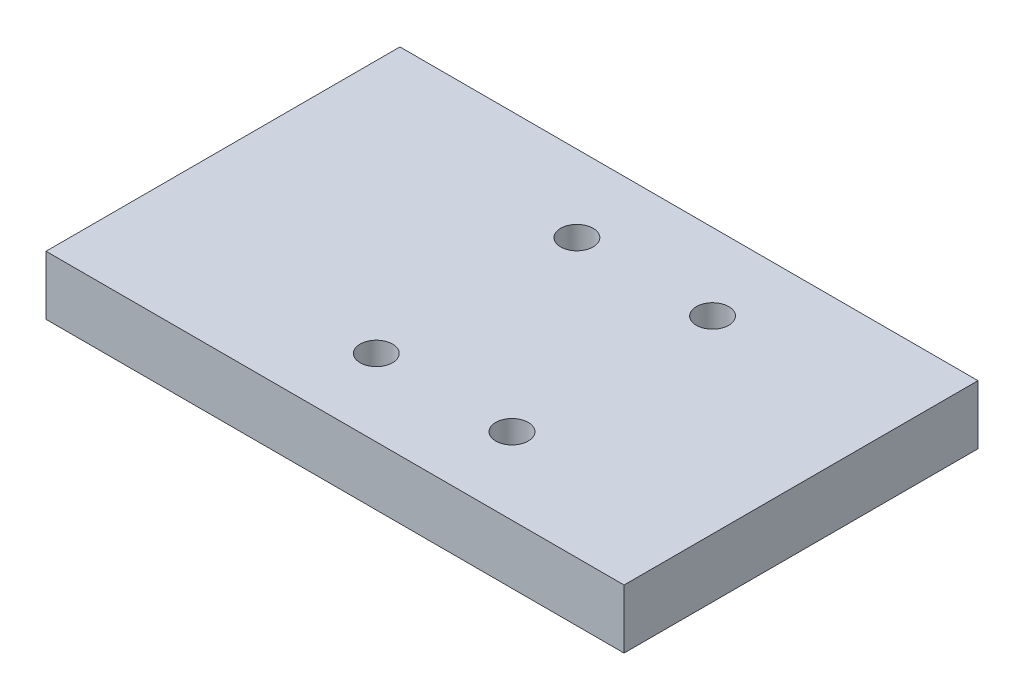
ISO-10303-21;
HEADER;
FILE_DESCRIPTION(('STEP AP214'),'2;1');
FILE_NAME('part.step','',(''),(''),'','','');
FILE_SCHEMA(('AUTOMOTIVE_DESIGN { 1 0 10303 214 1 1 1 1 }'));
ENDSEC;
DATA;
#1=APPLICATION_CONTEXT('core data for automotive mechanical design processes');
#2=APPLICATION_PROTOCOL_DEFINITION('international standard','automotive_design',2000,#1);
#3=PRODUCT_CONTEXT('',#1,'mechanical');
#4=PRODUCT('Part','Part','',(#3));
#5=PRODUCT_RELATED_PRODUCT_CATEGORY('part','',(#4));
#6=PRODUCT_DEFINITION_FORMATION('','',#4);
#7=PRODUCT_DEFINITION_CONTEXT('part definition',#1,'design');
#8=PRODUCT_DEFINITION('design','',#6,#7);
#9=PRODUCT_DEFINITION_SHAPE('','',#8);
#10=(LENGTH_UNIT() NAMED_UNIT(*) SI_UNIT(.MILLI.,.METRE.));
#11=(NAMED_UNIT(*) PLANE_ANGLE_UNIT() SI_UNIT($,.RADIAN.));
#12=(NAMED_UNIT(*) SI_UNIT($,.STERADIAN.) SOLID_ANGLE_UNIT());
#13=UNCERTAINTY_MEASURE_WITH_UNIT(LENGTH_MEASURE(1.E-05),#10,'distance_accuracy_value','');
#14=(GEOMETRIC_REPRESENTATION_CONTEXT(3) GLOBAL_UNCERTAINTY_ASSIGNED_CONTEXT((#13)) GLOBAL_UNIT_ASSIGNED_CONTEXT((#10,
#11,#12)) REPRESENTATION_CONTEXT('',''));
#15=CARTESIAN_POINT('',(0.,0.,0.));
#16=DIRECTION('',(0.,0.,1.));
#17=DIRECTION('',(1.,0.,0.));
#18=AXIS2_PLACEMENT_3D('',#15,#16,#17);
#19=CARTESIAN_POINT('',(-49.,10.,30.));
#20=DIRECTION('',(1.,0.,0.));
#21=DIRECTION('',(0.,0.,-1.));
#22=AXIS2_PLACEMENT_3D('',#19,#20,#21);
#23=PLANE('',#22);
#24=DIRECTION('',(0.,0.,1.));
#25=VECTOR('',#24,1.);
#26=CARTESIAN_POINT('',(-49.,0.,30.));
#27=LINE('',#26,#25);
#28=CARTESIAN_POINT('',(-49.,0.,-30.));
#29=VERTEX_POINT('',#28);
#30=CARTESIAN_POINT('',(-49.,0.,30.));
#31=VERTEX_POINT('',#30);
#32=EDGE_CURVE('E104',#29,#31,#27,.T.);
#33=ORIENTED_EDGE('',*,*,#32,.T.);
#34=DIRECTION('',(0.,-1.,0.));
#35=VECTOR('',#34,1.);
#36=CARTESIAN_POINT('',(-49.,10.,30.));
#37=LINE('',#36,#35);
#38=CARTESIAN_POINT('',(-49.,10.,30.));
#39=VERTEX_POINT('',#38);
#40=EDGE_CURVE('E11',#39,#31,#37,.T.);
#41=ORIENTED_EDGE('',*,*,#40,.F.);
#42=DIRECTION('',(0.,0.,1.));
#43=VECTOR('',#42,1.);
#44=CARTESIAN_POINT('',(-49.,10.,30.));
#45=LINE('',#44,#43);
#46=CARTESIAN_POINT('',(-49.,10.,-30.));
#47=VERTEX_POINT('',#46);
#48=EDGE_CURVE('E92',#47,#39,#45,.T.);
#49=ORIENTED_EDGE('',*,*,#48,.F.);
#50=DIRECTION('',(0.,-1.,0.));
#51=VECTOR('',#50,1.);
#52=CARTESIAN_POINT('',(-49.,10.,-30.));
#53=LINE('',#52,#51);
#54=EDGE_CURVE('E100',#47,#29,#53,.T.);
#55=ORIENTED_EDGE('',*,*,#54,.T.);
#56=EDGE_LOOP('',(#33,#41,#49,#55));
#57=FACE_BOUND('',#56,.T.);
#58=ADVANCED_FACE('F41',(#57),#23,.F.);
#59=CARTESIAN_POINT('',(49.,10.,30.));
#60=DIRECTION('',(0.,0.,-1.));
#61=DIRECTION('',(-1.,0.,0.));
#62=AXIS2_PLACEMENT_3D('',#59,#60,#61);
#63=PLANE('',#62);
#64=DIRECTION('',(1.,0.,0.));
#65=VECTOR('',#64,1.);
#66=CARTESIAN_POINT('',(49.,0.,30.));
#67=LINE('',#66,#65);
#68=CARTESIAN_POINT('',(49.,0.,30.));
#69=VERTEX_POINT('',#68);
#70=EDGE_CURVE('E96',#31,#69,#67,.T.);
#71=ORIENTED_EDGE('',*,*,#70,.T.);
#72=DIRECTION('',(0.,-1.,0.));
#73=VECTOR('',#72,1.);
#74=CARTESIAN_POINT('',(49.,10.,30.));
#75=LINE('',#74,#73);
#76=CARTESIAN_POINT('',(49.,10.,30.));
#77=VERTEX_POINT('',#76);
#78=EDGE_CURVE('E49',#77,#69,#75,.T.);
#79=ORIENTED_EDGE('',*,*,#78,.F.);
#80=DIRECTION('',(1.,0.,0.));
#81=VECTOR('',#80,1.);
#82=CARTESIAN_POINT('',(49.,10.,30.));
#83=LINE('',#82,#81);
#84=EDGE_CURVE('E87',#39,#77,#83,.T.);
#85=ORIENTED_EDGE('',*,*,#84,.F.);
#86=ORIENTED_EDGE('',*,*,#40,.T.);
#87=EDGE_LOOP('',(#71,#79,#85,#86));
#88=FACE_BOUND('',#87,.T.);
#89=ADVANCED_FACE('F95',(#88),#63,.F.);
#90=CARTESIAN_POINT('',(49.,10.,30.));
#91=DIRECTION('',(-1.,0.,0.));
#92=DIRECTION('',(0.,0.,1.));
#93=AXIS2_PLACEMENT_3D('',#90,#91,#92);
#94=PLANE('',#93);
#95=DIRECTION('',(0.,0.,-1.));
#96=VECTOR('',#95,1.);
#97=CARTESIAN_POINT('',(49.,0.,30.));
#98=LINE('',#97,#96);
#99=CARTESIAN_POINT('',(49.,0.,-30.));
#100=VERTEX_POINT('',#99);
#101=EDGE_CURVE('E74',#69,#100,#98,.T.);
#102=ORIENTED_EDGE('',*,*,#101,.T.);
#103=DIRECTION('',(0.,-1.,0.));
#104=VECTOR('',#103,1.);
#105=CARTESIAN_POINT('',(49.,10.,-30.));
#106=LINE('',#105,#104);
#107=CARTESIAN_POINT('',(49.,10.,-30.));
#108=VERTEX_POINT('',#107);
#109=EDGE_CURVE('E97',#108,#100,#106,.T.);
#110=ORIENTED_EDGE('',*,*,#109,.F.);
#111=DIRECTION('',(0.,0.,-1.));
#112=VECTOR('',#111,1.);
#113=CARTESIAN_POINT('',(49.,10.,30.));
#114=LINE('',#113,#112);
#115=EDGE_CURVE('E90',#77,#108,#114,.T.);
#116=ORIENTED_EDGE('',*,*,#115,.F.);
#117=ORIENTED_EDGE('',*,*,#78,.T.);
#118=EDGE_LOOP('',(#102,#110,#116,#117));
#119=FACE_BOUND('',#118,.T.);
#120=ADVANCED_FACE('F98',(#119),#94,.F.);
#121=CARTESIAN_POINT('',(49.,10.,-30.));
#122=DIRECTION('',(0.,0.,1.));
#123=DIRECTION('',(1.,0.,0.));
#124=AXIS2_PLACEMENT_3D('',#121,#122,#123);
#125=PLANE('',#124);
#126=DIRECTION('',(-1.,0.,0.));
#127=VECTOR('',#126,1.);
#128=CARTESIAN_POINT('',(49.,0.,-30.));
#129=LINE('',#128,#127);
#130=EDGE_CURVE('E80',#100,#29,#129,.T.);
#131=ORIENTED_EDGE('',*,*,#130,.T.);
#132=ORIENTED_EDGE('',*,*,#54,.F.);
#133=DIRECTION('',(-1.,0.,0.));
#134=VECTOR('',#133,1.);
#135=CARTESIAN_POINT('',(49.,10.,-30.));
#136=LINE('',#135,#134);
#137=EDGE_CURVE('E57',#108,#47,#136,.T.);
#138=ORIENTED_EDGE('',*,*,#137,.F.);
#139=ORIENTED_EDGE('',*,*,#109,.T.);
#140=EDGE_LOOP('',(#131,#132,#138,#139));
#141=FACE_BOUND('',#140,.T.);
#142=ADVANCED_FACE('F112',(#141),#125,.F.);
#143=CARTESIAN_POINT('',(0.,10.,0.));
#144=DIRECTION('',(0.,1.,0.));
#145=DIRECTION('',(0.,0.,1.));
#146=AXIS2_PLACEMENT_3D('',#143,#144,#145);
#147=PLANE('',#146);
#148=CARTESIAN_POINT('',(-6.00000000000001,10.,-17.));
#149=DIRECTION('',(0.,-1.,0.));
#150=DIRECTION('',(0.,0.,-1.));
#151=AXIS2_PLACEMENT_3D('',#148,#149,#150);
#152=CIRCLE('',#151,2.75);
#153=CARTESIAN_POINT('',(-6.00000000000001,10.,-19.75));
#154=VERTEX_POINT('',#153);
#155=EDGE_CURVE('E153',#154,#154,#152,.T.);
#156=ORIENTED_EDGE('',*,*,#155,.T.);
#157=EDGE_LOOP('',(#156));
#158=FACE_BOUND('',#157,.T.);
#159=CARTESIAN_POINT('',(17.,10.,-17.));
#160=DIRECTION('',(0.,-1.,0.));
#161=DIRECTION('',(0.,0.,-1.));
#162=AXIS2_PLACEMENT_3D('',#159,#160,#161);
#163=CIRCLE('',#162,2.75);
#164=CARTESIAN_POINT('',(17.,10.,-19.75));
#165=VERTEX_POINT('',#164);
#166=EDGE_CURVE('E141',#165,#165,#163,.T.);
#167=ORIENTED_EDGE('',*,*,#166,.T.);
#168=EDGE_LOOP('',(#167));
#169=FACE_BOUND('',#168,.T.);
#170=CARTESIAN_POINT('',(17.,10.,17.));
#171=DIRECTION('',(0.,-1.,0.));
#172=DIRECTION('',(0.,0.,-1.));
#173=AXIS2_PLACEMENT_3D('',#170,#171,#172);
#174=CIRCLE('',#173,2.75);
#175=CARTESIAN_POINT('',(17.,10.,14.25));
#176=VERTEX_POINT('',#175);
#177=EDGE_CURVE('E129',#176,#176,#174,.T.);
#178=ORIENTED_EDGE('',*,*,#177,.T.);
#179=EDGE_LOOP('',(#178));
#180=FACE_BOUND('',#179,.T.);
#181=CARTESIAN_POINT('',(-6.00000000000001,10.,17.));
#182=DIRECTION('',(0.,-1.,0.));
#183=DIRECTION('',(0.,0.,-1.));
#184=AXIS2_PLACEMENT_3D('',#181,#182,#183);
#185=CIRCLE('',#184,2.75);
#186=CARTESIAN_POINT('',(-6.00000000000001,10.,14.25));
#187=VERTEX_POINT('',#186);
#188=EDGE_CURVE('E107',#187,#187,#185,.T.);
#189=ORIENTED_EDGE('',*,*,#188,.T.);
#190=EDGE_LOOP('',(#189));
#191=FACE_BOUND('',#190,.T.);
#192=ORIENTED_EDGE('',*,*,#48,.T.);
#193=ORIENTED_EDGE('',*,*,#84,.T.);
#194=ORIENTED_EDGE('',*,*,#115,.T.);
#195=ORIENTED_EDGE('',*,*,#137,.T.);
#196=EDGE_LOOP('',(#192,#193,#194,#195));
#197=FACE_BOUND('',#196,.T.);
#198=ADVANCED_FACE('F88',(#158,#169,#180,#191,#197),#147,.T.);
#199=CARTESIAN_POINT('',(0.,0.,0.));
#200=DIRECTION('',(0.,1.,0.));
#201=DIRECTION('',(0.,0.,1.));
#202=AXIS2_PLACEMENT_3D('',#199,#200,#201);
#203=PLANE('',#202);
#204=CARTESIAN_POINT('',(-6.00000000000001,0.,-17.));
#205=DIRECTION('',(0.,-1.,0.));
#206=DIRECTION('',(0.,0.,-1.));
#207=AXIS2_PLACEMENT_3D('',#204,#205,#206);
#208=CIRCLE('',#207,4.99999999999999);
#209=CARTESIAN_POINT('',(-6.00000000000001,0.,-22.));
#210=VERTEX_POINT('',#209);
#211=EDGE_CURVE('E162',#210,#210,#208,.T.);
#212=ORIENTED_EDGE('',*,*,#211,.F.);
#213=EDGE_LOOP('',(#212));
#214=FACE_BOUND('',#213,.T.);
#215=CARTESIAN_POINT('',(17.,0.,-17.));
#216=DIRECTION('',(0.,-1.,0.));
#217=DIRECTION('',(0.,0.,-1.));
#218=AXIS2_PLACEMENT_3D('',#215,#216,#217);
#219=CIRCLE('',#218,4.99999999999999);
#220=CARTESIAN_POINT('',(17.,0.,-22.));
#221=VERTEX_POINT('',#220);
#222=EDGE_CURVE('E150',#221,#221,#219,.T.);
#223=ORIENTED_EDGE('',*,*,#222,.F.);
#224=EDGE_LOOP('',(#223));
#225=FACE_BOUND('',#224,.T.);
#226=CARTESIAN_POINT('',(17.,0.,17.));
#227=DIRECTION('',(0.,-1.,0.));
#228=DIRECTION('',(0.,0.,-1.));
#229=AXIS2_PLACEMENT_3D('',#226,#227,#228);
#230=CIRCLE('',#229,4.99999999999999);
#231=CARTESIAN_POINT('',(17.,0.,12.));
#232=VERTEX_POINT('',#231);
#233=EDGE_CURVE('E138',#232,#232,#230,.T.);
#234=ORIENTED_EDGE('',*,*,#233,.F.);
#235=EDGE_LOOP('',(#234));
#236=FACE_BOUND('',#235,.T.);
#237=CARTESIAN_POINT('',(-6.00000000000001,0.,17.));
#238=DIRECTION('',(0.,-1.,0.));
#239=DIRECTION('',(0.,0.,-1.));
#240=AXIS2_PLACEMENT_3D('',#237,#238,#239);
#241=CIRCLE('',#240,4.99999999999999);
#242=CARTESIAN_POINT('',(-6.00000000000001,0.,12.));
#243=VERTEX_POINT('',#242);
#244=EDGE_CURVE('E126',#243,#243,#241,.T.);
#245=ORIENTED_EDGE('',*,*,#244,.F.);
#246=EDGE_LOOP('',(#245));
#247=FACE_BOUND('',#246,.T.);
#248=ORIENTED_EDGE('',*,*,#32,.F.);
#249=ORIENTED_EDGE('',*,*,#130,.F.);
#250=ORIENTED_EDGE('',*,*,#101,.F.);
#251=ORIENTED_EDGE('',*,*,#70,.F.);
#252=EDGE_LOOP('',(#248,#249,#250,#251));
#253=FACE_BOUND('',#252,.T.);
#254=ADVANCED_FACE('F115',(#214,#225,#236,#247,#253),#203,.F.);
#255=CARTESIAN_POINT('',(-6.00000000000001,0.,17.));
#256=DIRECTION('',(0.,-1.,0.));
#257=DIRECTION('',(0.,0.,-1.));
#258=AXIS2_PLACEMENT_3D('',#255,#256,#257);
#259=CYLINDRICAL_SURFACE('',#258,2.75);
#260=ORIENTED_EDGE('',*,*,#188,.F.);
#261=EDGE_LOOP('',(#260));
#262=FACE_BOUND('',#261,.T.);
#263=CARTESIAN_POINT('',(-6.00000000000001,5.4,17.));
#264=DIRECTION('',(0.,-1.,0.));
#265=DIRECTION('',(0.,0.,-1.));
#266=AXIS2_PLACEMENT_3D('',#263,#264,#265);
#267=CIRCLE('',#266,2.75);
#268=CARTESIAN_POINT('',(-6.00000000000001,5.4,14.25));
#269=VERTEX_POINT('',#268);
#270=EDGE_CURVE('E120',#269,#269,#267,.T.);
#271=ORIENTED_EDGE('',*,*,#270,.T.);
#272=EDGE_LOOP('',(#271));
#273=FACE_BOUND('',#272,.T.);
#274=ADVANCED_FACE('F170',(#262,#273),#259,.F.);
#275=CARTESIAN_POINT('',(-3.25000000000001,5.4,17.));
#276=DIRECTION('',(0.,1.,0.));
#277=DIRECTION('',(0.,0.,1.));
#278=AXIS2_PLACEMENT_3D('',#275,#276,#277);
#279=PLANE('',#278);
#280=ORIENTED_EDGE('',*,*,#270,.F.);
#281=EDGE_LOOP('',(#280));
#282=FACE_BOUND('',#281,.T.);
#283=CARTESIAN_POINT('',(-6.00000000000001,5.4,17.));
#284=DIRECTION('',(0.,-1.,0.));
#285=DIRECTION('',(0.,0.,-1.));
#286=AXIS2_PLACEMENT_3D('',#283,#284,#285);
#287=CIRCLE('',#286,5.);
#288=CARTESIAN_POINT('',(-6.00000000000001,5.4,12.));
#289=VERTEX_POINT('',#288);
#290=EDGE_CURVE('E123',#289,#289,#287,.T.);
#291=ORIENTED_EDGE('',*,*,#290,.T.);
#292=EDGE_LOOP('',(#291));
#293=FACE_BOUND('',#292,.T.);
#294=ADVANCED_FACE('F181',(#282,#293),#279,.F.);
#295=CARTESIAN_POINT('',(-6.00000000000001,0.,17.));
#296=DIRECTION('',(0.,-1.,0.));
#297=DIRECTION('',(0.,0.,-1.));
#298=AXIS2_PLACEMENT_3D('',#295,#296,#297);
#299=CYLINDRICAL_SURFACE('',#298,4.99999999999999);
#300=ORIENTED_EDGE('',*,*,#290,.F.);
#301=EDGE_LOOP('',(#300));
#302=FACE_BOUND('',#301,.T.);
#303=ORIENTED_EDGE('',*,*,#244,.T.);
#304=EDGE_LOOP('',(#303));
#305=FACE_BOUND('',#304,.T.);
#306=ADVANCED_FACE('F178',(#302,#305),#299,.F.);
#307=CARTESIAN_POINT('',(17.,0.,17.));
#308=DIRECTION('',(0.,-1.,0.));
#309=DIRECTION('',(0.,0.,-1.));
#310=AXIS2_PLACEMENT_3D('',#307,#308,#309);
#311=CYLINDRICAL_SURFACE('',#310,2.75);
#312=ORIENTED_EDGE('',*,*,#177,.F.);
#313=EDGE_LOOP('',(#312));
#314=FACE_BOUND('',#313,.T.);
#315=CARTESIAN_POINT('',(17.,5.4,17.));
#316=DIRECTION('',(0.,-1.,0.));
#317=DIRECTION('',(0.,0.,-1.));
#318=AXIS2_PLACEMENT_3D('',#315,#316,#317);
#319=CIRCLE('',#318,2.75);
#320=CARTESIAN_POINT('',(17.,5.4,14.25));
#321=VERTEX_POINT('',#320);
#322=EDGE_CURVE('E132',#321,#321,#319,.T.);
#323=ORIENTED_EDGE('',*,*,#322,.T.);
#324=EDGE_LOOP('',(#323));
#325=FACE_BOUND('',#324,.T.);
#326=ADVANCED_FACE('F180',(#314,#325),#311,.F.);
#327=CARTESIAN_POINT('',(19.75,5.4,17.));
#328=DIRECTION('',(0.,1.,0.));
#329=DIRECTION('',(0.,0.,1.));
#330=AXIS2_PLACEMENT_3D('',#327,#328,#329);
#331=PLANE('',#330);
#332=ORIENTED_EDGE('',*,*,#322,.F.);
#333=EDGE_LOOP('',(#332));
#334=FACE_BOUND('',#333,.T.);
#335=CARTESIAN_POINT('',(17.,5.4,17.));
#336=DIRECTION('',(0.,-1.,0.));
#337=DIRECTION('',(0.,0.,-1.));
#338=AXIS2_PLACEMENT_3D('',#335,#336,#337);
#339=CIRCLE('',#338,5.);
#340=CARTESIAN_POINT('',(17.,5.4,12.));
#341=VERTEX_POINT('',#340);
#342=EDGE_CURVE('E135',#341,#341,#339,.T.);
#343=ORIENTED_EDGE('',*,*,#342,.T.);
#344=EDGE_LOOP('',(#343));
#345=FACE_BOUND('',#344,.T.);
#346=ADVANCED_FACE('F188',(#334,#345),#331,.F.);
#347=CARTESIAN_POINT('',(17.,0.,17.));
#348=DIRECTION('',(0.,-1.,0.));
#349=DIRECTION('',(0.,0.,-1.));
#350=AXIS2_PLACEMENT_3D('',#347,#348,#349);
#351=CYLINDRICAL_SURFACE('',#350,5.);
#352=ORIENTED_EDGE('',*,*,#342,.F.);
#353=EDGE_LOOP('',(#352));
#354=FACE_BOUND('',#353,.T.);
#355=ORIENTED_EDGE('',*,*,#233,.T.);
#356=EDGE_LOOP('',(#355));
#357=FACE_BOUND('',#356,.T.);
#358=ADVANCED_FACE('F236',(#354,#357),#351,.F.);
#359=CARTESIAN_POINT('',(17.,0.,-17.));
#360=DIRECTION('',(0.,-1.,0.));
#361=DIRECTION('',(0.,0.,-1.));
#362=AXIS2_PLACEMENT_3D('',#359,#360,#361);
#363=CYLINDRICAL_SURFACE('',#362,2.75);
#364=ORIENTED_EDGE('',*,*,#166,.F.);
#365=EDGE_LOOP('',(#364));
#366=FACE_BOUND('',#365,.T.);
#367=CARTESIAN_POINT('',(17.,5.4,-17.));
#368=DIRECTION('',(0.,-1.,0.));
#369=DIRECTION('',(0.,0.,-1.));
#370=AXIS2_PLACEMENT_3D('',#367,#368,#369);
#371=CIRCLE('',#370,2.75);
#372=CARTESIAN_POINT('',(17.,5.4,-19.75));
#373=VERTEX_POINT('',#372);
#374=EDGE_CURVE('E144',#373,#373,#371,.T.);
#375=ORIENTED_EDGE('',*,*,#374,.T.);
#376=EDGE_LOOP('',(#375));
#377=FACE_BOUND('',#376,.T.);
#378=ADVANCED_FACE('F244',(#366,#377),#363,.F.);
#379=CARTESIAN_POINT('',(19.75,5.4,-17.));
#380=DIRECTION('',(0.,1.,0.));
#381=DIRECTION('',(0.,0.,1.));
#382=AXIS2_PLACEMENT_3D('',#379,#380,#381);
#383=PLANE('',#382);
#384=ORIENTED_EDGE('',*,*,#374,.F.);
#385=EDGE_LOOP('',(#384));
#386=FACE_BOUND('',#385,.T.);
#387=CARTESIAN_POINT('',(17.,5.4,-17.));
#388=DIRECTION('',(0.,-1.,0.));
#389=DIRECTION('',(0.,0.,-1.));
#390=AXIS2_PLACEMENT_3D('',#387,#388,#389);
#391=CIRCLE('',#390,5.);
#392=CARTESIAN_POINT('',(17.,5.4,-22.));
#393=VERTEX_POINT('',#392);
#394=EDGE_CURVE('E147',#393,#393,#391,.T.);
#395=ORIENTED_EDGE('',*,*,#394,.T.);
#396=EDGE_LOOP('',(#395));
#397=FACE_BOUND('',#396,.T.);
#398=ADVANCED_FACE('F252',(#386,#397),#383,.F.);
#399=CARTESIAN_POINT('',(17.,0.,-17.));
#400=DIRECTION('',(0.,-1.,0.));
#401=DIRECTION('',(0.,0.,-1.));
#402=AXIS2_PLACEMENT_3D('',#399,#400,#401);
#403=CYLINDRICAL_SURFACE('',#402,5.);
#404=ORIENTED_EDGE('',*,*,#394,.F.);
#405=EDGE_LOOP('',(#404));
#406=FACE_BOUND('',#405,.T.);
#407=ORIENTED_EDGE('',*,*,#222,.T.);
#408=EDGE_LOOP('',(#407));
#409=FACE_BOUND('',#408,.T.);
#410=ADVANCED_FACE('F260',(#406,#409),#403,.F.);
#411=CARTESIAN_POINT('',(-6.00000000000001,0.,-17.));
#412=DIRECTION('',(0.,-1.,0.));
#413=DIRECTION('',(0.,0.,-1.));
#414=AXIS2_PLACEMENT_3D('',#411,#412,#413);
#415=CYLINDRICAL_SURFACE('',#414,2.75);
#416=ORIENTED_EDGE('',*,*,#155,.F.);
#417=EDGE_LOOP('',(#416));
#418=FACE_BOUND('',#417,.T.);
#419=CARTESIAN_POINT('',(-6.00000000000001,5.4,-17.));
#420=DIRECTION('',(0.,-1.,0.));
#421=DIRECTION('',(0.,0.,-1.));
#422=AXIS2_PLACEMENT_3D('',#419,#420,#421);
#423=CIRCLE('',#422,2.75);
#424=CARTESIAN_POINT('',(-6.00000000000001,5.4,-19.75));
#425=VERTEX_POINT('',#424);
#426=EDGE_CURVE('E156',#425,#425,#423,.T.);
#427=ORIENTED_EDGE('',*,*,#426,.T.);
#428=EDGE_LOOP('',(#427));
#429=FACE_BOUND('',#428,.T.);
#430=ADVANCED_FACE('F268',(#418,#429),#415,.F.);
#431=CARTESIAN_POINT('',(-3.25000000000001,5.4,-17.));
#432=DIRECTION('',(0.,1.,0.));
#433=DIRECTION('',(0.,0.,1.));
#434=AXIS2_PLACEMENT_3D('',#431,#432,#433);
#435=PLANE('',#434);
#436=ORIENTED_EDGE('',*,*,#426,.F.);
#437=EDGE_LOOP('',(#436));
#438=FACE_BOUND('',#437,.T.);
#439=CARTESIAN_POINT('',(-6.00000000000001,5.4,-17.));
#440=DIRECTION('',(0.,-1.,0.));
#441=DIRECTION('',(0.,0.,-1.));
#442=AXIS2_PLACEMENT_3D('',#439,#440,#441);
#443=CIRCLE('',#442,5.);
#444=CARTESIAN_POINT('',(-6.00000000000001,5.4,-22.));
#445=VERTEX_POINT('',#444);
#446=EDGE_CURVE('E159',#445,#445,#443,.T.);
#447=ORIENTED_EDGE('',*,*,#446,.T.);
#448=EDGE_LOOP('',(#447));
#449=FACE_BOUND('',#448,.T.);
#450=ADVANCED_FACE('F276',(#438,#449),#435,.F.);
#451=CARTESIAN_POINT('',(-6.00000000000001,0.,-17.));
#452=DIRECTION('',(0.,-1.,0.));
#453=DIRECTION('',(0.,0.,-1.));
#454=AXIS2_PLACEMENT_3D('',#451,#452,#453);
#455=CYLINDRICAL_SURFACE('',#454,4.99999999999999);
#456=ORIENTED_EDGE('',*,*,#446,.F.);
#457=EDGE_LOOP('',(#456));
#458=FACE_BOUND('',#457,.T.);
#459=ORIENTED_EDGE('',*,*,#211,.T.);
#460=EDGE_LOOP('',(#459));
#461=FACE_BOUND('',#460,.T.);
#462=ADVANCED_FACE('F166',(#458,#461),#455,.F.);
#463=CLOSED_SHELL('',(#58,#89,#120,#142,#198,#254,#274,#294,#306,#326,#346,#358,#378,#398,#410,
#430,#450,#462));
#464=MANIFOLD_SOLID_BREP('B2',#463);
#465=ADVANCED_BREP_SHAPE_REPRESENTATION('',(#18,#464),#14);
#466=SHAPE_DEFINITION_REPRESENTATION(#9,#465);
ENDSEC;
END-ISO-10303-21;
